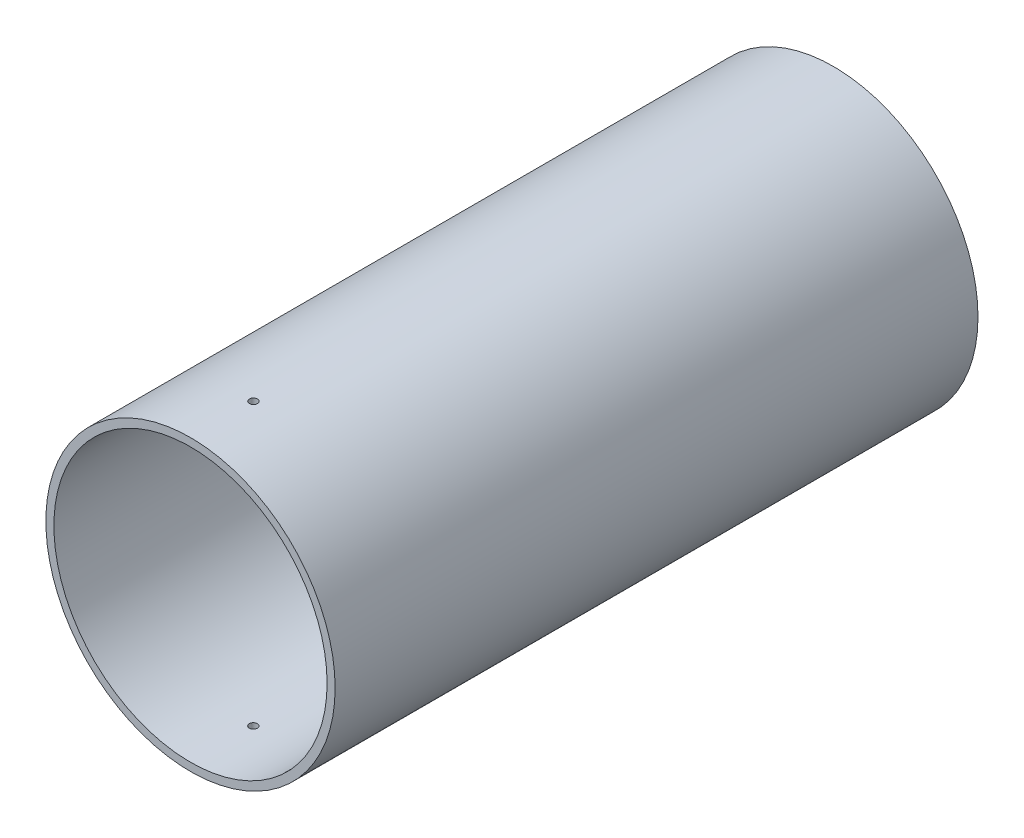
ISO-10303-21;
HEADER;
FILE_DESCRIPTION(('STEP AP214'),'2;1');
FILE_NAME('part.step','',(''),(''),'','','');
FILE_SCHEMA(('AUTOMOTIVE_DESIGN { 1 0 10303 214 1 1 1 1 }'));
ENDSEC;
DATA;
#1=APPLICATION_CONTEXT('core data for automotive mechanical design processes');
#2=APPLICATION_PROTOCOL_DEFINITION('international standard','automotive_design',2000,#1);
#3=PRODUCT_CONTEXT('',#1,'mechanical');
#4=PRODUCT('Part','Part','',(#3));
#5=PRODUCT_RELATED_PRODUCT_CATEGORY('part','',(#4));
#6=PRODUCT_DEFINITION_FORMATION('','',#4);
#7=PRODUCT_DEFINITION_CONTEXT('part definition',#1,'design');
#8=PRODUCT_DEFINITION('design','',#6,#7);
#9=PRODUCT_DEFINITION_SHAPE('','',#8);
#10=(LENGTH_UNIT() NAMED_UNIT(*) SI_UNIT(.MILLI.,.METRE.));
#11=(NAMED_UNIT(*) PLANE_ANGLE_UNIT() SI_UNIT($,.RADIAN.));
#12=(NAMED_UNIT(*) SI_UNIT($,.STERADIAN.) SOLID_ANGLE_UNIT());
#13=UNCERTAINTY_MEASURE_WITH_UNIT(LENGTH_MEASURE(1.E-05),#10,'distance_accuracy_value','');
#14=(GEOMETRIC_REPRESENTATION_CONTEXT(3) GLOBAL_UNCERTAINTY_ASSIGNED_CONTEXT((#13)) GLOBAL_UNIT_ASSIGNED_CONTEXT((#10,
#11,#12)) REPRESENTATION_CONTEXT('',''));
#15=CARTESIAN_POINT('',(0.,0.,0.));
#16=DIRECTION('',(0.,0.,1.));
#17=DIRECTION('',(1.,0.,0.));
#18=AXIS2_PLACEMENT_3D('',#15,#16,#17);
#19=CARTESIAN_POINT('',(0.,0.,508.));
#20=DIRECTION('',(0.,0.,-1.));
#21=DIRECTION('',(-1.,0.,0.));
#22=AXIS2_PLACEMENT_3D('',#19,#20,#21);
#23=CYLINDRICAL_SURFACE('',#22,114.3);
#24=CARTESIAN_POINT('',(0.,-114.3,461.486748056768));
#25=CARTESIAN_POINT('',(0.178304243364325,-114.299999405569,461.486740161005));
#26=CARTESIAN_POINT('',(0.356736898466218,-114.299578300448,461.471677609893));
#27=CARTESIAN_POINT('',(0.7086855496256,-114.297938910975,461.411800543113));
#28=CARTESIAN_POINT('',(0.882195407258947,-114.296719673371,461.366950449698));
#29=CARTESIAN_POINT('',(1.21914884315361,-114.293622100607,461.248778333115));
#30=CARTESIAN_POINT('',(1.38259728423447,-114.29174408683,461.17547019129));
#31=CARTESIAN_POINT('',(1.69482204221797,-114.287540823839,461.002482717332));
#32=CARTESIAN_POINT('',(1.84360193806812,-114.28521568413,460.902809839842));
#33=CARTESIAN_POINT('',(2.12237339241985,-114.280378926487,460.679873674926));
#34=CARTESIAN_POINT('',(2.25235844206783,-114.277867244406,460.556602249255));
#35=CARTESIAN_POINT('',(2.48979580533134,-114.272941052429,460.289981963523));
#36=CARTESIAN_POINT('',(2.59724722334344,-114.270526546399,460.146632305827));
#37=CARTESIAN_POINT('',(2.78657573933243,-114.266066694851,459.843902611634));
#38=CARTESIAN_POINT('',(2.86844917368285,-114.264021402236,459.68452028304));
#39=CARTESIAN_POINT('',(3.00427368605122,-114.260531165424,459.354265919234));
#40=CARTESIAN_POINT('',(3.05822486809455,-114.259086218992,459.18339392683));
#41=CARTESIAN_POINT('',(3.13666007533643,-114.25696004588,458.835057576605));
#42=CARTESIAN_POINT('',(3.1611517470595,-114.256278621025,458.657594941789));
#43=CARTESIAN_POINT('',(3.17999624937451,-114.25575572758,458.301075883385));
#44=CARTESIAN_POINT('',(3.17434919085896,-114.255914255901,458.122019465664));
#45=CARTESIAN_POINT('',(3.13308302696788,-114.257053207266,457.767447479594));
#46=CARTESIAN_POINT('',(3.09747219532296,-114.258033403428,457.591930947495));
#47=CARTESIAN_POINT('',(2.99730213846072,-114.260704834522,457.249368257657));
#48=CARTESIAN_POINT('',(2.93274285424055,-114.262396070903,457.082322117183));
#49=CARTESIAN_POINT('',(2.77649900518575,-114.266299189412,456.761415483241));
#50=CARTESIAN_POINT('',(2.68481064706228,-114.268511144341,456.60755683758));
#51=CARTESIAN_POINT('',(2.47691418847675,-114.27320626575,456.317412985366));
#52=CARTESIAN_POINT('',(2.36070604139609,-114.275689432746,456.181127812227));
#53=CARTESIAN_POINT('',(2.10702191466068,-114.280648057349,455.929951330965));
#54=CARTESIAN_POINT('',(1.96953875786252,-114.283123512064,455.815067271458));
#55=CARTESIAN_POINT('',(1.67723260093751,-114.287786838909,455.610009980863));
#56=CARTESIAN_POINT('',(1.52240959808936,-114.289974710993,455.519836753653));
#57=CARTESIAN_POINT('',(1.19981463380222,-114.293816261226,455.366761658921));
#58=CARTESIAN_POINT('',(1.0320425652132,-114.295469934953,455.303860017091));
#59=CARTESIAN_POINT('',(0.688313751075913,-114.298056601011,455.207118272748));
#60=CARTESIAN_POINT('',(0.512357024681366,-114.298989595028,455.173278102229));
#61=CARTESIAN_POINT('',(0.157316686307218,-114.30002951295,455.135628782835));
#62=CARTESIAN_POINT('',(-0.0217658613824627,-114.300136712729,455.131809604775));
#63=CARTESIAN_POINT('',(-0.378029616769688,-114.299513688525,455.154284550888));
#64=CARTESIAN_POINT('',(-0.555210826343544,-114.298783465368,455.180578645341));
#65=CARTESIAN_POINT('',(-0.902614389423178,-114.2965680745,455.262525438477));
#66=CARTESIAN_POINT('',(-1.07283781733696,-114.295083023827,455.318173585767));
#67=CARTESIAN_POINT('',(-1.40152673456444,-114.291525332987,455.457244205423));
#68=CARTESIAN_POINT('',(-1.55999220383976,-114.289452691818,455.540666725123));
#69=CARTESIAN_POINT('',(-1.8607130896797,-114.284952645515,455.732943847849));
#70=CARTESIAN_POINT('',(-2.00296418817766,-114.28252514627,455.841805202085));
#71=CARTESIAN_POINT('',(-2.26717496752363,-114.277589291076,456.081859894175));
#72=CARTESIAN_POINT('',(-2.3891346027611,-114.275080934946,456.213053282226));
#73=CARTESIAN_POINT('',(-2.6093339068071,-114.270265358913,456.494090885793));
#74=CARTESIAN_POINT('',(-2.7075671042556,-114.267958193994,456.643940172834));
#75=CARTESIAN_POINT('',(-2.87748077665023,-114.263805988154,456.958009950982));
#76=CARTESIAN_POINT('',(-2.94916130689176,-114.261960946271,457.12223041216));
#77=CARTESIAN_POINT('',(-3.06392356916353,-114.258941402434,457.460356523079));
#78=CARTESIAN_POINT('',(-3.10700949455481,-114.257766802164,457.634260748652));
#79=CARTESIAN_POINT('',(-3.16337324872919,-114.256220297756,457.986838111932));
#80=CARTESIAN_POINT('',(-3.1766510923206,-114.255848393218,458.16551124727));
#81=CARTESIAN_POINT('',(-3.17302127212727,-114.25594924722,458.522489654801));
#82=CARTESIAN_POINT('',(-3.15612382266086,-114.256421719938,458.700795031027));
#83=CARTESIAN_POINT('',(-3.092644059842,-114.258157464831,459.052037148789));
#84=CARTESIAN_POINT('',(-3.04606168750459,-114.259420738578,459.224973879656));
#85=CARTESIAN_POINT('',(-2.92453562217871,-114.262595635698,459.560573982941));
#86=CARTESIAN_POINT('',(-2.84959144356333,-114.264507270174,459.723237179394));
#87=CARTESIAN_POINT('',(-2.67347314348551,-114.26876330027,460.033668828707));
#88=CARTESIAN_POINT('',(-2.57229998216588,-114.271107680049,460.181437826514));
#89=CARTESIAN_POINT('',(-2.34656736869081,-114.275965685524,460.457932287432));
#90=CARTESIAN_POINT('',(-2.22200249636297,-114.27847935036,460.586653324492));
#91=CARTESIAN_POINT('',(-1.95299433429601,-114.283392801243,460.821390987502));
#92=CARTESIAN_POINT('',(-1.80854612741082,-114.285792558924,460.927401980632));
#93=CARTESIAN_POINT('',(-1.503819642619,-114.290208440735,461.113725814343));
#94=CARTESIAN_POINT('',(-1.34353154697732,-114.292224324642,461.194022584576));
#95=CARTESIAN_POINT('',(-1.01186782714363,-114.295640825866,461.326472250035));
#96=CARTESIAN_POINT('',(-0.840505709764148,-114.297042177054,461.378658731535));
#97=CARTESIAN_POINT('',(-0.5567164545989,-114.298696869394,461.439565279381));
#98=CARTESIAN_POINT('',(-0.446131625139351,-114.299183425209,461.457236583533));
#99=CARTESIAN_POINT('',(-0.223714716898864,-114.299835176969,461.480830447971));
#100=CARTESIAN_POINT('',(-0.111882638431878,-114.300000372995,461.486753011214));
#101=CARTESIAN_POINT('',(0.,-114.3,461.486748056768));
#102=B_SPLINE_CURVE_WITH_KNOTS('',3,(#24,#25,#26,#27,#28,#29,#30,#31,#32,#33,#34,#35,#36,#37,
#38,#39,#40,#41,#42,#43,#44,#45,#46,#47,#48,#49,#50,#51,#52,#53,#54,#55,#56,#57,#58,#59,#60,#61,
#62,#63,#64,#65,#66,#67,#68,#69,#70,#71,#72,#73,#74,#75,#76,#77,#78,#79,#80,#81,#82,#83,#84,#85,
#86,#87,#88,#89,#90,#91,#92,#93,#94,#95,#96,#97,#98,#99,#100,#101),.UNSPECIFIED.,.T.,.F.,(4,2,2,
2,2,2,2,2,2,2,2,2,2,2,2,2,2,2,2,2,2,2,2,2,2,2,2,2,2,2,2,2,2,2,2,2,2,2,4),(0.,0.534504346040706,
1.06964824605864,1.60453143947551,2.13928380321481,2.67422091605889,3.2091792860518,
3.74421424496013,4.27924721056144,4.81414127276355,5.34903336687666,5.88377781265055,
6.4185233483476,6.95334368953269,7.48816504756167,8.02316722296624,8.55816948233357,
9.09317616917474,9.62818160405717,10.16300830077,10.6978344696474,11.2325777372081,
11.7673219160792,12.3022081721647,12.8370956305355,13.3721288145473,13.9071608843569,
14.442114475072,14.9770678000283,15.5118400779327,16.0466134184513,16.5813959160761,
17.1161588401209,17.6510458291293,18.186065334067,18.721418554955,19.2561307070241,
19.5915224532475,19.9269141150497),.UNSPECIFIED.);
#103=CARTESIAN_POINT('',(0.,-114.3,461.486748056768));
#104=VERTEX_POINT('',#103);
#105=EDGE_CURVE('E77',#104,#104,#102,.T.);
#106=ORIENTED_EDGE('',*,*,#105,.T.);
#107=EDGE_LOOP('',(#106));
#108=FACE_BOUND('',#107,.T.);
#109=CARTESIAN_POINT('',(0.,114.3,461.486748056768));
#110=CARTESIAN_POINT('',(-0.178304243364325,114.299999405569,461.486740161005));
#111=CARTESIAN_POINT('',(-0.356736898466218,114.299578300448,461.471677609893));
#112=CARTESIAN_POINT('',(-0.7086855496256,114.297938910975,461.411800543113));
#113=CARTESIAN_POINT('',(-0.882195407258947,114.296719673371,461.366950449698));
#114=CARTESIAN_POINT('',(-1.21914884315361,114.293622100607,461.248778333115));
#115=CARTESIAN_POINT('',(-1.38259728423447,114.29174408683,461.17547019129));
#116=CARTESIAN_POINT('',(-1.69482204221797,114.287540823839,461.002482717332));
#117=CARTESIAN_POINT('',(-1.84360193806812,114.28521568413,460.902809839842));
#118=CARTESIAN_POINT('',(-2.12237339241985,114.280378926487,460.679873674926));
#119=CARTESIAN_POINT('',(-2.25235844206783,114.277867244406,460.556602249255));
#120=CARTESIAN_POINT('',(-2.48979580533134,114.272941052429,460.289981963523));
#121=CARTESIAN_POINT('',(-2.59724722334344,114.270526546399,460.146632305827));
#122=CARTESIAN_POINT('',(-2.78657573933243,114.266066694851,459.843902611634));
#123=CARTESIAN_POINT('',(-2.86844917368285,114.264021402236,459.68452028304));
#124=CARTESIAN_POINT('',(-3.00427368605122,114.260531165424,459.354265919234));
#125=CARTESIAN_POINT('',(-3.05822486809455,114.259086218992,459.18339392683));
#126=CARTESIAN_POINT('',(-3.13666007533643,114.25696004588,458.835057576605));
#127=CARTESIAN_POINT('',(-3.1611517470595,114.256278621025,458.657594941789));
#128=CARTESIAN_POINT('',(-3.17999624937451,114.25575572758,458.301075883385));
#129=CARTESIAN_POINT('',(-3.17434919085896,114.255914255901,458.122019465664));
#130=CARTESIAN_POINT('',(-3.13308302696788,114.257053207266,457.767447479594));
#131=CARTESIAN_POINT('',(-3.09747219532296,114.258033403428,457.591930947495));
#132=CARTESIAN_POINT('',(-2.99730213846072,114.260704834522,457.249368257657));
#133=CARTESIAN_POINT('',(-2.93274285424055,114.262396070903,457.082322117183));
#134=CARTESIAN_POINT('',(-2.77649900518575,114.266299189412,456.761415483241));
#135=CARTESIAN_POINT('',(-2.68481064706228,114.268511144341,456.60755683758));
#136=CARTESIAN_POINT('',(-2.47691418847675,114.27320626575,456.317412985366));
#137=CARTESIAN_POINT('',(-2.36070604139609,114.275689432746,456.181127812227));
#138=CARTESIAN_POINT('',(-2.10702191466068,114.280648057349,455.929951330965));
#139=CARTESIAN_POINT('',(-1.96953875786252,114.283123512064,455.815067271458));
#140=CARTESIAN_POINT('',(-1.67723260093751,114.287786838909,455.610009980863));
#141=CARTESIAN_POINT('',(-1.52240959808936,114.289974710993,455.519836753653));
#142=CARTESIAN_POINT('',(-1.19981463380222,114.293816261226,455.366761658921));
#143=CARTESIAN_POINT('',(-1.0320425652132,114.295469934953,455.303860017091));
#144=CARTESIAN_POINT('',(-0.688313751075913,114.298056601011,455.207118272748));
#145=CARTESIAN_POINT('',(-0.512357024681366,114.298989595028,455.173278102229));
#146=CARTESIAN_POINT('',(-0.157316686307218,114.30002951295,455.135628782835));
#147=CARTESIAN_POINT('',(0.0217658613824627,114.300136712729,455.131809604775));
#148=CARTESIAN_POINT('',(0.378029616769688,114.299513688525,455.154284550888));
#149=CARTESIAN_POINT('',(0.555210826343544,114.298783465368,455.180578645341));
#150=CARTESIAN_POINT('',(0.902614389423178,114.2965680745,455.262525438477));
#151=CARTESIAN_POINT('',(1.07283781733696,114.295083023827,455.318173585767));
#152=CARTESIAN_POINT('',(1.40152673456444,114.291525332987,455.457244205423));
#153=CARTESIAN_POINT('',(1.55999220383976,114.289452691818,455.540666725123));
#154=CARTESIAN_POINT('',(1.8607130896797,114.284952645515,455.732943847849));
#155=CARTESIAN_POINT('',(2.00296418817766,114.28252514627,455.841805202085));
#156=CARTESIAN_POINT('',(2.26717496752363,114.277589291076,456.081859894175));
#157=CARTESIAN_POINT('',(2.3891346027611,114.275080934946,456.213053282226));
#158=CARTESIAN_POINT('',(2.6093339068071,114.270265358913,456.494090885793));
#159=CARTESIAN_POINT('',(2.7075671042556,114.267958193994,456.643940172834));
#160=CARTESIAN_POINT('',(2.87748077665023,114.263805988154,456.958009950982));
#161=CARTESIAN_POINT('',(2.94916130689176,114.261960946271,457.12223041216));
#162=CARTESIAN_POINT('',(3.06392356916353,114.258941402434,457.460356523079));
#163=CARTESIAN_POINT('',(3.10700949455481,114.257766802164,457.634260748652));
#164=CARTESIAN_POINT('',(3.16337324872919,114.256220297756,457.986838111932));
#165=CARTESIAN_POINT('',(3.1766510923206,114.255848393218,458.16551124727));
#166=CARTESIAN_POINT('',(3.17302127212727,114.25594924722,458.522489654801));
#167=CARTESIAN_POINT('',(3.15612382266086,114.256421719938,458.700795031027));
#168=CARTESIAN_POINT('',(3.092644059842,114.258157464831,459.052037148789));
#169=CARTESIAN_POINT('',(3.04606168750459,114.259420738578,459.224973879656));
#170=CARTESIAN_POINT('',(2.92453562217871,114.262595635698,459.560573982941));
#171=CARTESIAN_POINT('',(2.84959144356333,114.264507270174,459.723237179394));
#172=CARTESIAN_POINT('',(2.67347314348551,114.26876330027,460.033668828707));
#173=CARTESIAN_POINT('',(2.57229998216588,114.271107680049,460.181437826514));
#174=CARTESIAN_POINT('',(2.34656736869081,114.275965685524,460.457932287432));
#175=CARTESIAN_POINT('',(2.22200249636297,114.27847935036,460.586653324492));
#176=CARTESIAN_POINT('',(1.95299433429601,114.283392801243,460.821390987502));
#177=CARTESIAN_POINT('',(1.80854612741082,114.285792558924,460.927401980632));
#178=CARTESIAN_POINT('',(1.503819642619,114.290208440735,461.113725814343));
#179=CARTESIAN_POINT('',(1.34353154697732,114.292224324642,461.194022584576));
#180=CARTESIAN_POINT('',(1.01186782714363,114.295640825866,461.326472250035));
#181=CARTESIAN_POINT('',(0.840505709764148,114.297042177054,461.378658731535));
#182=CARTESIAN_POINT('',(0.5567164545989,114.298696869394,461.439565279381));
#183=CARTESIAN_POINT('',(0.446131625139351,114.299183425209,461.457236583533));
#184=CARTESIAN_POINT('',(0.223714716898864,114.299835176969,461.480830447971));
#185=CARTESIAN_POINT('',(0.111882638431878,114.300000372995,461.486753011214));
#186=CARTESIAN_POINT('',(0.,114.3,461.486748056768));
#187=B_SPLINE_CURVE_WITH_KNOTS('',3,(#109,#110,#111,#112,#113,#114,#115,#116,#117,#118,#119,
#120,#121,#122,#123,#124,#125,#126,#127,#128,#129,#130,#131,#132,#133,#134,#135,#136,#137,#138,
#139,#140,#141,#142,#143,#144,#145,#146,#147,#148,#149,#150,#151,#152,#153,#154,#155,#156,#157,
#158,#159,#160,#161,#162,#163,#164,#165,#166,#167,#168,#169,#170,#171,#172,#173,#174,#175,#176,
#177,#178,#179,#180,#181,#182,#183,#184,#185,#186),.UNSPECIFIED.,.T.,.F.,(4,2,2,2,2,2,2,2,2,2,2,
2,2,2,2,2,2,2,2,2,2,2,2,2,2,2,2,2,2,2,2,2,2,2,2,2,2,2,4),(0.,0.534504346040706,1.06964824605864,
1.60453143947551,2.13928380321481,2.67422091605889,3.2091792860518,3.74421424496013,
4.27924721056144,4.81414127276355,5.34903336687666,5.88377781265055,6.4185233483476,
6.95334368953269,7.48816504756167,8.02316722296624,8.55816948233357,9.09317616917474,
9.62818160405717,10.16300830077,10.6978344696474,11.2325777372081,11.7673219160792,
12.3022081721647,12.8370956305355,13.3721288145473,13.9071608843569,14.442114475072,
14.9770678000283,15.5118400779327,16.0466134184513,16.5813959160761,17.1161588401209,
17.6510458291293,18.186065334067,18.721418554955,19.2561307070241,19.5915224532475,
19.9269141150497),.UNSPECIFIED.);
#188=CARTESIAN_POINT('',(0.,114.3,461.486748056768));
#189=VERTEX_POINT('',#188);
#190=EDGE_CURVE('E73',#189,#189,#187,.T.);
#191=ORIENTED_EDGE('',*,*,#190,.T.);
#192=EDGE_LOOP('',(#191));
#193=FACE_BOUND('',#192,.T.);
#194=CARTESIAN_POINT('',(0.,0.,508.));
#195=DIRECTION('',(0.,0.,1.));
#196=DIRECTION('',(1.,0.,0.));
#197=AXIS2_PLACEMENT_3D('',#194,#195,#196);
#198=CIRCLE('',#197,114.3);
#199=CARTESIAN_POINT('',(114.3,0.,508.));
#200=VERTEX_POINT('',#199);
#201=EDGE_CURVE('E10',#200,#200,#198,.T.);
#202=ORIENTED_EDGE('',*,*,#201,.F.);
#203=EDGE_LOOP('',(#202));
#204=FACE_BOUND('',#203,.T.);
#205=CARTESIAN_POINT('',(0.,0.,0.));
#206=DIRECTION('',(0.,0.,1.));
#207=DIRECTION('',(1.,0.,0.));
#208=AXIS2_PLACEMENT_3D('',#205,#206,#207);
#209=CIRCLE('',#208,114.3);
#210=CARTESIAN_POINT('',(114.3,0.,0.));
#211=VERTEX_POINT('',#210);
#212=EDGE_CURVE('E44',#211,#211,#209,.T.);
#213=ORIENTED_EDGE('',*,*,#212,.T.);
#214=EDGE_LOOP('',(#213));
#215=FACE_BOUND('',#214,.T.);
#216=ADVANCED_FACE('F32',(#108,#193,#204,#215),#23,.T.);
#217=CARTESIAN_POINT('',(0.,0.,508.));
#218=DIRECTION('',(0.,0.,1.));
#219=DIRECTION('',(1.,0.,0.));
#220=AXIS2_PLACEMENT_3D('',#217,#218,#219);
#221=PLANE('',#220);
#222=CARTESIAN_POINT('',(0.,0.,508.));
#223=DIRECTION('',(0.,0.,1.));
#224=DIRECTION('',(1.,0.,0.));
#225=AXIS2_PLACEMENT_3D('',#222,#223,#224);
#226=CIRCLE('',#225,107.95);
#227=CARTESIAN_POINT('',(107.95,0.,508.));
#228=VERTEX_POINT('',#227);
#229=EDGE_CURVE('E52',#228,#228,#226,.T.);
#230=ORIENTED_EDGE('',*,*,#229,.F.);
#231=EDGE_LOOP('',(#230));
#232=FACE_BOUND('',#231,.T.);
#233=ORIENTED_EDGE('',*,*,#201,.T.);
#234=EDGE_LOOP('',(#233));
#235=FACE_BOUND('',#234,.T.);
#236=ADVANCED_FACE('F88',(#232,#235),#221,.T.);
#237=CARTESIAN_POINT('',(0.,0.,0.));
#238=DIRECTION('',(0.,0.,1.));
#239=DIRECTION('',(1.,0.,0.));
#240=AXIS2_PLACEMENT_3D('',#237,#238,#239);
#241=PLANE('',#240);
#242=ORIENTED_EDGE('',*,*,#212,.F.);
#243=EDGE_LOOP('',(#242));
#244=FACE_BOUND('',#243,.T.);
#245=ADVANCED_FACE('F90',(#244),#241,.F.);
#246=CARTESIAN_POINT('',(0.,0.,12.7));
#247=DIRECTION('',(0.,0.,1.));
#248=DIRECTION('',(1.,0.,0.));
#249=AXIS2_PLACEMENT_3D('',#246,#247,#248);
#250=CYLINDRICAL_SURFACE('',#249,107.95);
#251=CARTESIAN_POINT('',(0.,-107.95,461.486748056768));
#252=CARTESIAN_POINT('',(-0.178299775960969,-107.949999370853,461.486740162575));
#253=CARTESIAN_POINT('',(-0.356727854355905,-107.94955351742,461.471678363267));
#254=CARTESIAN_POINT('',(-0.708667171808641,-107.947817781209,461.41180445676));
#255=CARTESIAN_POINT('',(-0.882172277315743,-107.946526889959,461.366956802058));
#256=CARTESIAN_POINT('',(-1.21911618510195,-107.943247269913,461.248791544091));
#257=CARTESIAN_POINT('',(-1.38255986204638,-107.941258882225,461.175487855295));
#258=CARTESIAN_POINT('',(-1.69477603578385,-107.9368085627,461.002511275723));
#259=CARTESIAN_POINT('',(-1.84355210442345,-107.934346746584,460.90284482667));
#260=CARTESIAN_POINT('',(-2.12232169057961,-107.929225550993,460.679919886696));
#261=CARTESIAN_POINT('',(-2.25230815071278,-107.926566097849,460.556652571481));
#262=CARTESIAN_POINT('',(-2.48974936165927,-107.92135001577,460.290040263669));
#263=CARTESIAN_POINT('',(-2.59720321559675,-107.918793390932,460.146694472257));
#264=CARTESIAN_POINT('',(-2.78653956636784,-107.914070913069,459.843968649075));
#265=CARTESIAN_POINT('',(-2.86841789732419,-107.911905123729,459.684586010721));
#266=CARTESIAN_POINT('',(-3.00425182923603,-107.908209208368,459.354329379616));
#267=CARTESIAN_POINT('',(-3.05820754002834,-107.906679079846,459.18345543207));
#268=CARTESIAN_POINT('',(-3.13664964972287,-107.904427549051,458.835119317709));
#269=CARTESIAN_POINT('',(-3.16114462749205,-107.903705911351,458.657659084322));
#270=CARTESIAN_POINT('',(-3.17999637133473,-107.903152021579,458.301144101909));
#271=CARTESIAN_POINT('',(-3.17435325515468,-107.903319766033,458.122089359114));
#272=CARTESIAN_POINT('',(-3.13309626416215,-107.904525505094,457.7675262708));
#273=CARTESIAN_POINT('',(-3.09749166725859,-107.905563230303,457.592016844658));
#274=CARTESIAN_POINT('',(-2.99733674760796,-107.908391523874,457.249467317925));
#275=CARTESIAN_POINT('',(-2.93278636242645,-107.910182093862,457.082427235602));
#276=CARTESIAN_POINT('',(-2.77656157313485,-107.914314537409,456.761528241154));
#277=CARTESIAN_POINT('',(-2.68488291634416,-107.916656497393,456.60767140054));
#278=CARTESIAN_POINT('',(-2.47700717756928,-107.921627619883,456.317529070627));
#279=CARTESIAN_POINT('',(-2.36081004212587,-107.924256783013,456.181243619642));
#280=CARTESIAN_POINT('',(-2.1071432705591,-107.929507124797,455.930058659387));
#281=CARTESIAN_POINT('',(-1.96966558794919,-107.932128300045,455.815167275876));
#282=CARTESIAN_POINT('',(-1.67736861213569,-107.937066217281,455.610094373592));
#283=CARTESIAN_POINT('',(-1.5225493161456,-107.939382959218,455.519912858789));
#284=CARTESIAN_POINT('',(-1.19995938539829,-107.94345087981,455.366820546562));
#285=CARTESIAN_POINT('',(-1.03218862967106,-107.94520205318,455.303910003893));
#286=CARTESIAN_POINT('',(-0.688460239700986,-107.947941347605,455.207150632001));
#287=CARTESIAN_POINT('',(-0.51250262689357,-107.948929470658,455.173301726692));
#288=CARTESIAN_POINT('',(-0.157465952472722,-107.950031022701,455.135636436592));
#289=CARTESIAN_POINT('',(0.0216119154249954,-107.950144779142,455.131808808863));
#290=CARTESIAN_POINT('',(0.377867709763922,-107.949485642101,455.154265429094));
#291=CARTESIAN_POINT('',(0.555045638317784,-107.948712749606,455.180549643567));
#292=CARTESIAN_POINT('',(0.902440746889567,-107.946367633046,455.262474526997));
#293=CARTESIAN_POINT('',(1.07265913158317,-107.944795547959,455.318110091947));
#294=CARTESIAN_POINT('',(1.401340227585,-107.941029200167,455.45715319698));
#295=CARTESIAN_POINT('',(1.55980291625899,-107.938834936265,455.540560790533));
#296=CARTESIAN_POINT('',(1.86052617228625,-107.934070609913,455.732809256368));
#297=CARTESIAN_POINT('',(2.00278190047545,-107.931500435743,455.841657695468));
#298=CARTESIAN_POINT('',(2.26700450559306,-107.926274323631,456.081686926195));
#299=CARTESIAN_POINT('',(2.38897133237297,-107.923618385477,456.212867773019));
#300=CARTESIAN_POINT('',(2.60919145811942,-107.918519226121,456.493886234808));
#301=CARTESIAN_POINT('',(2.70743750208059,-107.916076070143,456.6437295365));
#302=CARTESIAN_POINT('',(2.87737759556825,-107.911678957708,456.957790348626));
#303=CARTESIAN_POINT('',(2.94907170367558,-107.909725000172,457.122007827345));
#304=CARTESIAN_POINT('',(3.06386008818598,-107.906527055271,457.460128134894));
#305=CARTESIAN_POINT('',(3.10695906117485,-107.905282951321,457.634029368133));
#306=CARTESIAN_POINT('',(3.16334915275206,-107.903644655838,457.986603393613));
#307=CARTESIAN_POINT('',(3.17664029446437,-107.903250463645,458.165276182152));
#308=CARTESIAN_POINT('',(3.17303688718654,-107.903356478055,458.5222487789));
#309=CARTESIAN_POINT('',(3.15615378376325,-107.903856345527,458.70054870286));
#310=CARTESIAN_POINT('',(3.0927046670237,-107.905693415608,459.05178223563));
#311=CARTESIAN_POINT('',(3.04613859482758,-107.907030619879,459.224715833794));
#312=CARTESIAN_POINT('',(2.92464690484695,-107.91039156961,459.56031226352));
#313=CARTESIAN_POINT('',(2.84972081002819,-107.912415326618,459.722974922263));
#314=CARTESIAN_POINT('',(2.67364003112815,-107.916921152636,460.033408839825));
#315=CARTESIAN_POINT('',(2.57248629870708,-107.919403205016,460.181180638682));
#316=CARTESIAN_POINT('',(2.34678846082013,-107.924546758428,460.457690406732));
#317=CARTESIAN_POINT('',(2.22223798298149,-107.927208308221,460.586423173312));
#318=CARTESIAN_POINT('',(1.95325646766015,-107.932410995794,460.821186869893));
#319=CARTESIAN_POINT('',(1.80882051440462,-107.934952103591,460.927212169898));
#320=CARTESIAN_POINT('',(1.50411277321496,-107.939628319908,461.113568601396));
#321=CARTESIAN_POINT('',(1.34383088471982,-107.9417631669,461.193883204284));
#322=CARTESIAN_POINT('',(1.0121755698198,-107.94538150333,461.326369111948));
#323=CARTESIAN_POINT('',(0.840815647409754,-107.94686576926,461.378573983746));
#324=CARTESIAN_POINT('',(0.55697742015435,-107.948618917656,461.439520707505));
#325=CARTESIAN_POINT('',(0.446341529814019,-107.949134576987,461.457208686188));
#326=CARTESIAN_POINT('',(0.223820615177488,-107.949825315598,461.480824837121));
#327=CARTESIAN_POINT('',(0.111935591234662,-107.950000394975,461.486753012697));
#328=CARTESIAN_POINT('',(0.,-107.95,461.486748056768));
#329=B_SPLINE_CURVE_WITH_KNOTS('',3,(#251,#252,#253,#254,#255,#256,#257,#258,#259,#260,#261,
#262,#263,#264,#265,#266,#267,#268,#269,#270,#271,#272,#273,#274,#275,#276,#277,#278,#279,#280,
#281,#282,#283,#284,#285,#286,#287,#288,#289,#290,#291,#292,#293,#294,#295,#296,#297,#298,#299,
#300,#301,#302,#303,#304,#305,#306,#307,#308,#309,#310,#311,#312,#313,#314,#315,#316,#317,#318,
#319,#320,#321,#322,#323,#324,#325,#326,#327,#328),.UNSPECIFIED.,.T.,.F.,(4,2,2,2,2,2,2,2,2,2,2,
2,2,2,2,2,2,2,2,2,2,2,2,2,2,2,2,2,2,2,2,2,2,2,2,2,2,2,4),(0.,0.534490748990281,1.06962052730811,
1.60448896609708,2.13922683066142,2.67416502395607,3.20912450560546,3.74417107891731,
4.27921554754633,4.81410417526337,5.34899071322674,5.88371167849256,6.41843379712718,
6.9532397842883,7.48804693753376,8.02305680539788,8.5580667592291,9.09308171079735,
9.62809526162945,10.1629084408353,10.6977210252899,11.232440639976,11.7671612841756,
12.302041172091,12.8369223820608,13.3719669788904,13.9070103952582,14.4419659120664,
14.9769210138729,15.5116732418401,16.0464265305582,16.5811888145781,17.1159316976593,
17.6508204358401,18.1858416389734,18.7212061030485,19.2559298398688,19.5914802049775,
19.9270304751628),.UNSPECIFIED.);
#330=CARTESIAN_POINT('',(0.,-107.95,461.486748056768));
#331=VERTEX_POINT('',#330);
#332=EDGE_CURVE('E36',#331,#331,#329,.T.);
#333=ORIENTED_EDGE('',*,*,#332,.T.);
#334=EDGE_LOOP('',(#333));
#335=FACE_BOUND('',#334,.T.);
#336=CARTESIAN_POINT('',(0.,107.95,461.486748056768));
#337=CARTESIAN_POINT('',(0.178299775960969,107.949999370853,461.486740162575));
#338=CARTESIAN_POINT('',(0.356727854355905,107.94955351742,461.471678363267));
#339=CARTESIAN_POINT('',(0.708667171808641,107.947817781209,461.41180445676));
#340=CARTESIAN_POINT('',(0.882172277315743,107.946526889959,461.366956802058));
#341=CARTESIAN_POINT('',(1.21911618510195,107.943247269913,461.248791544091));
#342=CARTESIAN_POINT('',(1.38255986204638,107.941258882225,461.175487855295));
#343=CARTESIAN_POINT('',(1.69477603578385,107.9368085627,461.002511275723));
#344=CARTESIAN_POINT('',(1.84355210442345,107.934346746584,460.90284482667));
#345=CARTESIAN_POINT('',(2.12232169057961,107.929225550993,460.679919886696));
#346=CARTESIAN_POINT('',(2.25230815071278,107.926566097849,460.556652571481));
#347=CARTESIAN_POINT('',(2.48974936165927,107.92135001577,460.290040263669));
#348=CARTESIAN_POINT('',(2.59720321559675,107.918793390932,460.146694472257));
#349=CARTESIAN_POINT('',(2.78653956636784,107.914070913069,459.843968649075));
#350=CARTESIAN_POINT('',(2.86841789732419,107.911905123729,459.684586010721));
#351=CARTESIAN_POINT('',(3.00425182923603,107.908209208368,459.354329379616));
#352=CARTESIAN_POINT('',(3.05820754002834,107.906679079846,459.18345543207));
#353=CARTESIAN_POINT('',(3.13664964972287,107.904427549051,458.835119317709));
#354=CARTESIAN_POINT('',(3.16114462749205,107.903705911351,458.657659084322));
#355=CARTESIAN_POINT('',(3.17999637133473,107.903152021579,458.301144101909));
#356=CARTESIAN_POINT('',(3.17435325515468,107.903319766033,458.122089359114));
#357=CARTESIAN_POINT('',(3.13309626416215,107.904525505094,457.7675262708));
#358=CARTESIAN_POINT('',(3.09749166725859,107.905563230303,457.592016844658));
#359=CARTESIAN_POINT('',(2.99733674760796,107.908391523874,457.249467317925));
#360=CARTESIAN_POINT('',(2.93278636242645,107.910182093862,457.082427235602));
#361=CARTESIAN_POINT('',(2.77656157313485,107.914314537409,456.761528241154));
#362=CARTESIAN_POINT('',(2.68488291634416,107.916656497393,456.60767140054));
#363=CARTESIAN_POINT('',(2.47700717756928,107.921627619883,456.317529070627));
#364=CARTESIAN_POINT('',(2.36081004212587,107.924256783013,456.181243619642));
#365=CARTESIAN_POINT('',(2.1071432705591,107.929507124797,455.930058659387));
#366=CARTESIAN_POINT('',(1.96966558794919,107.932128300045,455.815167275876));
#367=CARTESIAN_POINT('',(1.67736861213569,107.937066217281,455.610094373592));
#368=CARTESIAN_POINT('',(1.5225493161456,107.939382959218,455.519912858789));
#369=CARTESIAN_POINT('',(1.19995938539829,107.94345087981,455.366820546562));
#370=CARTESIAN_POINT('',(1.03218862967106,107.94520205318,455.303910003893));
#371=CARTESIAN_POINT('',(0.688460239700986,107.947941347605,455.207150632001));
#372=CARTESIAN_POINT('',(0.51250262689357,107.948929470658,455.173301726692));
#373=CARTESIAN_POINT('',(0.157465952472722,107.950031022701,455.135636436592));
#374=CARTESIAN_POINT('',(-0.0216119154249954,107.950144779142,455.131808808863));
#375=CARTESIAN_POINT('',(-0.377867709763922,107.949485642101,455.154265429094));
#376=CARTESIAN_POINT('',(-0.555045638317784,107.948712749606,455.180549643567));
#377=CARTESIAN_POINT('',(-0.902440746889567,107.946367633046,455.262474526997));
#378=CARTESIAN_POINT('',(-1.07265913158317,107.944795547959,455.318110091947));
#379=CARTESIAN_POINT('',(-1.401340227585,107.941029200167,455.45715319698));
#380=CARTESIAN_POINT('',(-1.55980291625899,107.938834936265,455.540560790533));
#381=CARTESIAN_POINT('',(-1.86052617228625,107.934070609913,455.732809256368));
#382=CARTESIAN_POINT('',(-2.00278190047545,107.931500435743,455.841657695468));
#383=CARTESIAN_POINT('',(-2.26700450559306,107.926274323631,456.081686926195));
#384=CARTESIAN_POINT('',(-2.38897133237297,107.923618385477,456.212867773019));
#385=CARTESIAN_POINT('',(-2.60919145811942,107.918519226121,456.493886234808));
#386=CARTESIAN_POINT('',(-2.70743750208059,107.916076070143,456.6437295365));
#387=CARTESIAN_POINT('',(-2.87737759556825,107.911678957708,456.957790348626));
#388=CARTESIAN_POINT('',(-2.94907170367558,107.909725000172,457.122007827345));
#389=CARTESIAN_POINT('',(-3.06386008818598,107.906527055271,457.460128134894));
#390=CARTESIAN_POINT('',(-3.10695906117485,107.905282951321,457.634029368133));
#391=CARTESIAN_POINT('',(-3.16334915275206,107.903644655838,457.986603393613));
#392=CARTESIAN_POINT('',(-3.17664029446437,107.903250463645,458.165276182152));
#393=CARTESIAN_POINT('',(-3.17303688718654,107.903356478055,458.5222487789));
#394=CARTESIAN_POINT('',(-3.15615378376325,107.903856345527,458.70054870286));
#395=CARTESIAN_POINT('',(-3.0927046670237,107.905693415608,459.05178223563));
#396=CARTESIAN_POINT('',(-3.04613859482758,107.907030619879,459.224715833794));
#397=CARTESIAN_POINT('',(-2.92464690484695,107.91039156961,459.56031226352));
#398=CARTESIAN_POINT('',(-2.84972081002819,107.912415326618,459.722974922263));
#399=CARTESIAN_POINT('',(-2.67364003112815,107.916921152636,460.033408839825));
#400=CARTESIAN_POINT('',(-2.57248629870708,107.919403205016,460.181180638682));
#401=CARTESIAN_POINT('',(-2.34678846082013,107.924546758428,460.457690406732));
#402=CARTESIAN_POINT('',(-2.22223798298149,107.927208308221,460.586423173312));
#403=CARTESIAN_POINT('',(-1.95325646766015,107.932410995794,460.821186869893));
#404=CARTESIAN_POINT('',(-1.80882051440462,107.934952103591,460.927212169898));
#405=CARTESIAN_POINT('',(-1.50411277321496,107.939628319908,461.113568601396));
#406=CARTESIAN_POINT('',(-1.34383088471982,107.9417631669,461.193883204284));
#407=CARTESIAN_POINT('',(-1.0121755698198,107.94538150333,461.326369111948));
#408=CARTESIAN_POINT('',(-0.840815647409754,107.94686576926,461.378573983746));
#409=CARTESIAN_POINT('',(-0.55697742015435,107.948618917656,461.439520707505));
#410=CARTESIAN_POINT('',(-0.446341529814019,107.949134576987,461.457208686188));
#411=CARTESIAN_POINT('',(-0.223820615177488,107.949825315598,461.480824837121));
#412=CARTESIAN_POINT('',(-0.111935591234662,107.950000394975,461.486753012697));
#413=CARTESIAN_POINT('',(0.,107.95,461.486748056768));
#414=B_SPLINE_CURVE_WITH_KNOTS('',3,(#336,#337,#338,#339,#340,#341,#342,#343,#344,#345,#346,
#347,#348,#349,#350,#351,#352,#353,#354,#355,#356,#357,#358,#359,#360,#361,#362,#363,#364,#365,
#366,#367,#368,#369,#370,#371,#372,#373,#374,#375,#376,#377,#378,#379,#380,#381,#382,#383,#384,
#385,#386,#387,#388,#389,#390,#391,#392,#393,#394,#395,#396,#397,#398,#399,#400,#401,#402,#403,
#404,#405,#406,#407,#408,#409,#410,#411,#412,#413),.UNSPECIFIED.,.T.,.F.,(4,2,2,2,2,2,2,2,2,2,2,
2,2,2,2,2,2,2,2,2,2,2,2,2,2,2,2,2,2,2,2,2,2,2,2,2,2,2,4),(0.,0.534490748990281,1.06962052730811,
1.60448896609708,2.13922683066142,2.67416502395607,3.20912450560546,3.74417107891731,
4.27921554754633,4.81410417526337,5.34899071322674,5.88371167849256,6.41843379712718,
6.9532397842883,7.48804693753376,8.02305680539788,8.5580667592291,9.09308171079735,
9.62809526162945,10.1629084408353,10.6977210252899,11.232440639976,11.7671612841756,
12.302041172091,12.8369223820608,13.3719669788904,13.9070103952582,14.4419659120664,
14.9769210138729,15.5116732418401,16.0464265305582,16.5811888145781,17.1159316976593,
17.6508204358401,18.1858416389734,18.7212061030485,19.2559298398688,19.5914802049775,
19.9270304751628),.UNSPECIFIED.);
#415=CARTESIAN_POINT('',(0.,107.95,461.486748056768));
#416=VERTEX_POINT('',#415);
#417=EDGE_CURVE('E54',#416,#416,#414,.T.);
#418=ORIENTED_EDGE('',*,*,#417,.T.);
#419=EDGE_LOOP('',(#418));
#420=FACE_BOUND('',#419,.T.);
#421=CARTESIAN_POINT('',(0.,0.,12.7));
#422=DIRECTION('',(0.,0.,1.));
#423=DIRECTION('',(1.,0.,0.));
#424=AXIS2_PLACEMENT_3D('',#421,#422,#423);
#425=CIRCLE('',#424,107.95);
#426=CARTESIAN_POINT('',(107.95,0.,12.7));
#427=VERTEX_POINT('',#426);
#428=EDGE_CURVE('E49',#427,#427,#425,.T.);
#429=ORIENTED_EDGE('',*,*,#428,.F.);
#430=EDGE_LOOP('',(#429));
#431=FACE_BOUND('',#430,.T.);
#432=ORIENTED_EDGE('',*,*,#229,.T.);
#433=EDGE_LOOP('',(#432));
#434=FACE_BOUND('',#433,.T.);
#435=ADVANCED_FACE('F58',(#335,#420,#431,#434),#250,.F.);
#436=CARTESIAN_POINT('',(0.,0.,12.7));
#437=DIRECTION('',(0.,0.,1.));
#438=DIRECTION('',(1.,0.,0.));
#439=AXIS2_PLACEMENT_3D('',#436,#437,#438);
#440=PLANE('',#439);
#441=ORIENTED_EDGE('',*,*,#428,.T.);
#442=EDGE_LOOP('',(#441));
#443=FACE_BOUND('',#442,.T.);
#444=ADVANCED_FACE('F67',(#443),#440,.T.);
#445=CARTESIAN_POINT('',(0.,-114.3,458.311748056768));
#446=DIRECTION('',(0.,1.,0.));
#447=DIRECTION('',(0.,0.,1.));
#448=AXIS2_PLACEMENT_3D('',#445,#446,#447);
#449=CYLINDRICAL_SURFACE('',#448,3.175);
#450=ORIENTED_EDGE('',*,*,#417,.F.);
#451=EDGE_LOOP('',(#450));
#452=FACE_BOUND('',#451,.T.);
#453=ORIENTED_EDGE('',*,*,#190,.F.);
#454=EDGE_LOOP('',(#453));
#455=FACE_BOUND('',#454,.T.);
#456=ADVANCED_FACE('F65',(#452,#455),#449,.F.);
#457=ORIENTED_EDGE('',*,*,#332,.F.);
#458=EDGE_LOOP('',(#457));
#459=FACE_BOUND('',#458,.T.);
#460=ORIENTED_EDGE('',*,*,#105,.F.);
#461=EDGE_LOOP('',(#460));
#462=FACE_BOUND('',#461,.T.);
#463=ADVANCED_FACE('F62',(#459,#462),#449,.F.);
#464=CLOSED_SHELL('',(#216,#236,#245,#435,#444,#456,#463));
#465=MANIFOLD_SOLID_BREP('B2',#464);
#466=ADVANCED_BREP_SHAPE_REPRESENTATION('',(#18,#465),#14);
#467=SHAPE_DEFINITION_REPRESENTATION(#9,#466);
ENDSEC;
END-ISO-10303-21;
